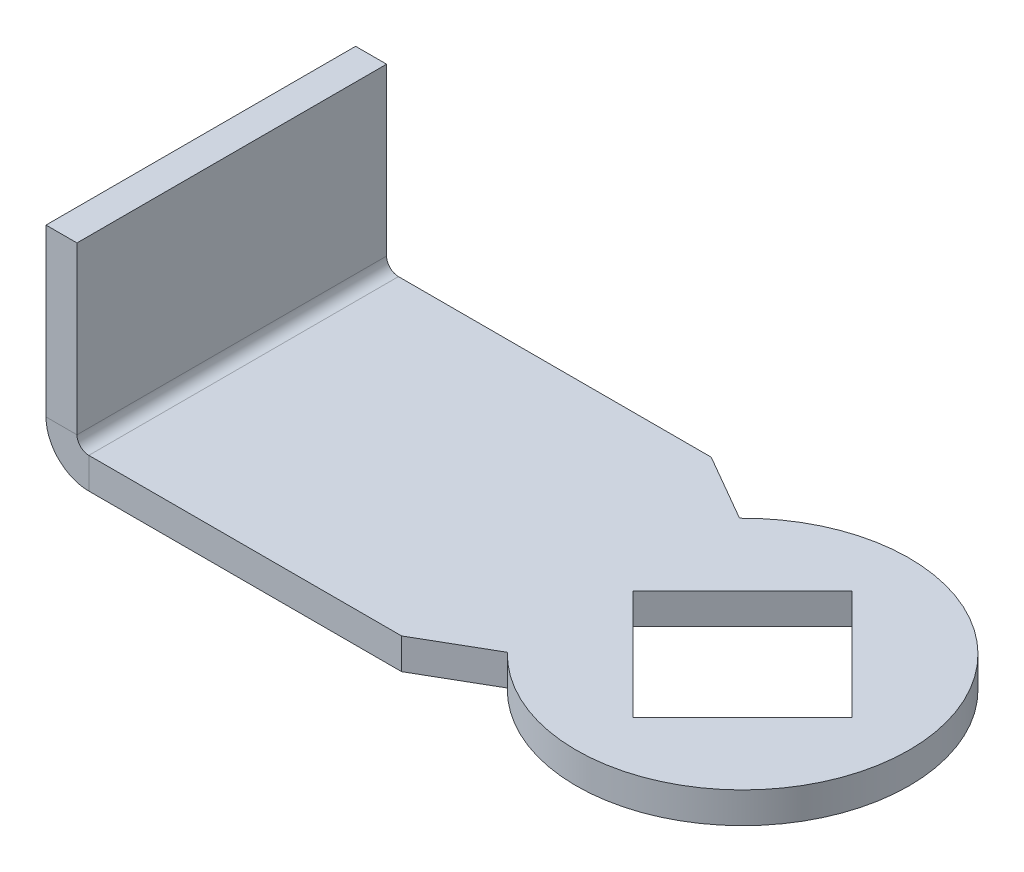
ISO-10303-21;
HEADER;
FILE_DESCRIPTION(('STEP AP214'),'2;1');
FILE_NAME('part.step','',(''),(''),'','','');
FILE_SCHEMA(('AUTOMOTIVE_DESIGN { 1 0 10303 214 1 1 1 1 }'));
ENDSEC;
DATA;
#1=APPLICATION_CONTEXT('core data for automotive mechanical design processes');
#2=APPLICATION_PROTOCOL_DEFINITION('international standard','automotive_design',2000,#1);
#3=PRODUCT_CONTEXT('',#1,'mechanical');
#4=PRODUCT('Part','Part','',(#3));
#5=PRODUCT_RELATED_PRODUCT_CATEGORY('part','',(#4));
#6=PRODUCT_DEFINITION_FORMATION('','',#4);
#7=PRODUCT_DEFINITION_CONTEXT('part definition',#1,'design');
#8=PRODUCT_DEFINITION('design','',#6,#7);
#9=PRODUCT_DEFINITION_SHAPE('','',#8);
#10=(LENGTH_UNIT() NAMED_UNIT(*) SI_UNIT(.MILLI.,.METRE.));
#11=(NAMED_UNIT(*) PLANE_ANGLE_UNIT() SI_UNIT($,.RADIAN.));
#12=(NAMED_UNIT(*) SI_UNIT($,.STERADIAN.) SOLID_ANGLE_UNIT());
#13=UNCERTAINTY_MEASURE_WITH_UNIT(LENGTH_MEASURE(1.E-05),#10,'distance_accuracy_value','');
#14=(GEOMETRIC_REPRESENTATION_CONTEXT(3) GLOBAL_UNCERTAINTY_ASSIGNED_CONTEXT((#13)) GLOBAL_UNIT_ASSIGNED_CONTEXT((#10,
#11,#12)) REPRESENTATION_CONTEXT('',''));
#15=CARTESIAN_POINT('',(0.,0.,0.));
#16=DIRECTION('',(0.,0.,1.));
#17=DIRECTION('',(1.,0.,0.));
#18=AXIS2_PLACEMENT_3D('',#15,#16,#17);
#19=CARTESIAN_POINT('',(-18.,-2.,0.));
#20=DIRECTION('',(0.,1.,0.));
#21=DIRECTION('',(0.,0.,1.));
#22=AXIS2_PLACEMENT_3D('',#19,#20,#21);
#23=PLANE('',#22);
#24=DIRECTION('',(0.,0.,1.));
#25=VECTOR('',#24,1.);
#26=CARTESIAN_POINT('',(-50.2334,-2.,10.));
#27=LINE('',#26,#25);
#28=CARTESIAN_POINT('',(-50.2334,-2.,10.));
#29=VERTEX_POINT('',#28);
#30=CARTESIAN_POINT('',(-50.2334,-2.,-10.));
#31=VERTEX_POINT('',#30);
#32=EDGE_CURVE('E216',#29,#31,#27,.F.);
#33=ORIENTED_EDGE('',*,*,#32,.T.);
#34=DIRECTION('',(-1.,0.,0.));
#35=VECTOR('',#34,1.);
#36=CARTESIAN_POINT('',(-53.,-2.,-10.));
#37=LINE('',#36,#35);
#38=CARTESIAN_POINT('',(-30.0315879192969,-2.,-10.));
#39=VERTEX_POINT('',#38);
#40=EDGE_CURVE('E251',#39,#31,#37,.T.);
#41=ORIENTED_EDGE('',*,*,#40,.F.);
#42=DIRECTION('',(-0.866025403784438,0.,-0.500000000000001));
#43=VECTOR('',#42,1.);
#44=CARTESIAN_POINT('',(-30.0315879192969,-2.,-10.));
#45=LINE('',#44,#43);
#46=CARTESIAN_POINT('',(-25.7014609003747,-2.,-7.5));
#47=VERTEX_POINT('',#46);
#48=EDGE_CURVE('E248',#47,#39,#45,.T.);
#49=ORIENTED_EDGE('',*,*,#48,.F.);
#50=CARTESIAN_POINT('',(-18.,-2.,0.));
#51=DIRECTION('',(0.,1.,0.));
#52=DIRECTION('',(0.,0.,1.));
#53=AXIS2_PLACEMENT_3D('',#50,#51,#52);
#54=CIRCLE('',#53,10.75);
#55=CARTESIAN_POINT('',(-25.7014609003747,-2.,7.49999999999999));
#56=VERTEX_POINT('',#55);
#57=EDGE_CURVE('E245',#56,#47,#54,.T.);
#58=ORIENTED_EDGE('',*,*,#57,.F.);
#59=DIRECTION('',(0.866025403784438,0.,-0.500000000000001));
#60=VECTOR('',#59,1.);
#61=CARTESIAN_POINT('',(-30.0315879192969,-2.,10.));
#62=LINE('',#61,#60);
#63=CARTESIAN_POINT('',(-30.0315879192969,-2.,10.));
#64=VERTEX_POINT('',#63);
#65=EDGE_CURVE('E241',#64,#56,#62,.T.);
#66=ORIENTED_EDGE('',*,*,#65,.F.);
#67=DIRECTION('',(1.,0.,0.));
#68=VECTOR('',#67,1.);
#69=CARTESIAN_POINT('',(-53.,-2.,10.));
#70=LINE('',#69,#68);
#71=EDGE_CURVE('E239',#29,#64,#70,.T.);
#72=ORIENTED_EDGE('',*,*,#71,.F.);
#73=EDGE_LOOP('',(#33,#41,#49,#58,#66,#72));
#74=FACE_BOUND('',#73,.T.);
#75=DIRECTION('',(-0.707106781186548,0.,-0.707106781186548));
#76=VECTOR('',#75,1.);
#77=CARTESIAN_POINT('',(-10.9289321881345,-2.,0.));
#78=LINE('',#77,#76);
#79=CARTESIAN_POINT('',(-10.9289321881345,-2.,0.));
#80=VERTEX_POINT('',#79);
#81=CARTESIAN_POINT('',(-18.,-2.,-7.07106781186548));
#82=VERTEX_POINT('',#81);
#83=EDGE_CURVE('E74',#80,#82,#78,.T.);
#84=ORIENTED_EDGE('',*,*,#83,.T.);
#85=DIRECTION('',(-0.707106781186547,0.,0.707106781186548));
#86=VECTOR('',#85,1.);
#87=CARTESIAN_POINT('',(-18.,-2.,-7.07106781186548));
#88=LINE('',#87,#86);
#89=CARTESIAN_POINT('',(-25.0710678118655,-2.,0.));
#90=VERTEX_POINT('',#89);
#91=EDGE_CURVE('E168',#82,#90,#88,.T.);
#92=ORIENTED_EDGE('',*,*,#91,.T.);
#93=DIRECTION('',(0.707106781186547,0.,0.707106781186548));
#94=VECTOR('',#93,1.);
#95=CARTESIAN_POINT('',(-25.0710678118655,-2.,0.));
#96=LINE('',#95,#94);
#97=CARTESIAN_POINT('',(-18.,-2.,7.07106781186547));
#98=VERTEX_POINT('',#97);
#99=EDGE_CURVE('E174',#90,#98,#96,.T.);
#100=ORIENTED_EDGE('',*,*,#99,.T.);
#101=DIRECTION('',(0.707106781186548,0.,-0.707106781186548));
#102=VECTOR('',#101,1.);
#103=CARTESIAN_POINT('',(-18.,-2.,7.07106781186547));
#104=LINE('',#103,#102);
#105=EDGE_CURVE('E177',#98,#80,#104,.T.);
#106=ORIENTED_EDGE('',*,*,#105,.T.);
#107=EDGE_LOOP('',(#84,#92,#100,#106));
#108=FACE_BOUND('',#107,.T.);
#109=ADVANCED_FACE('F59',(#74,#108),#23,.F.);
#110=CARTESIAN_POINT('',(-18.,0.,0.));
#111=DIRECTION('',(0.,1.,0.));
#112=DIRECTION('',(0.,0.,1.));
#113=AXIS2_PLACEMENT_3D('',#110,#111,#112);
#114=PLANE('',#113);
#115=DIRECTION('',(-1.,0.,0.));
#116=VECTOR('',#115,1.);
#117=CARTESIAN_POINT('',(-53.,0.,-10.));
#118=LINE('',#117,#116);
#119=CARTESIAN_POINT('',(-30.0315879192969,0.,-10.));
#120=VERTEX_POINT('',#119);
#121=CARTESIAN_POINT('',(-50.2334,0.,-10.));
#122=VERTEX_POINT('',#121);
#123=EDGE_CURVE('E242',#120,#122,#118,.T.);
#124=ORIENTED_EDGE('',*,*,#123,.T.);
#125=DIRECTION('',(0.,0.,1.));
#126=VECTOR('',#125,1.);
#127=CARTESIAN_POINT('',(-50.2334,0.,10.));
#128=LINE('',#127,#126);
#129=CARTESIAN_POINT('',(-50.2334,0.,10.));
#130=VERTEX_POINT('',#129);
#131=EDGE_CURVE('E228',#130,#122,#128,.F.);
#132=ORIENTED_EDGE('',*,*,#131,.F.);
#133=DIRECTION('',(1.,0.,0.));
#134=VECTOR('',#133,1.);
#135=CARTESIAN_POINT('',(-53.,0.,10.));
#136=LINE('',#135,#134);
#137=CARTESIAN_POINT('',(-30.0315879192969,0.,10.));
#138=VERTEX_POINT('',#137);
#139=EDGE_CURVE('E236',#130,#138,#136,.T.);
#140=ORIENTED_EDGE('',*,*,#139,.T.);
#141=DIRECTION('',(0.866025403784438,0.,-0.500000000000001));
#142=VECTOR('',#141,1.);
#143=CARTESIAN_POINT('',(-30.0315879192969,0.,10.));
#144=LINE('',#143,#142);
#145=CARTESIAN_POINT('',(-25.7014609003747,0.,7.49999999999999));
#146=VERTEX_POINT('',#145);
#147=EDGE_CURVE('E256',#138,#146,#144,.T.);
#148=ORIENTED_EDGE('',*,*,#147,.T.);
#149=CARTESIAN_POINT('',(-18.,0.,0.));
#150=DIRECTION('',(0.,1.,0.));
#151=DIRECTION('',(0.,0.,1.));
#152=AXIS2_PLACEMENT_3D('',#149,#150,#151);
#153=CIRCLE('',#152,10.75);
#154=CARTESIAN_POINT('',(-25.7014609003747,0.,-7.5));
#155=VERTEX_POINT('',#154);
#156=EDGE_CURVE('E259',#146,#155,#153,.T.);
#157=ORIENTED_EDGE('',*,*,#156,.T.);
#158=DIRECTION('',(-0.866025403784438,0.,-0.500000000000001));
#159=VECTOR('',#158,1.);
#160=CARTESIAN_POINT('',(-30.0315879192969,0.,-10.));
#161=LINE('',#160,#159);
#162=EDGE_CURVE('E262',#155,#120,#161,.T.);
#163=ORIENTED_EDGE('',*,*,#162,.T.);
#164=EDGE_LOOP('',(#124,#132,#140,#148,#157,#163));
#165=FACE_BOUND('',#164,.T.);
#166=DIRECTION('',(0.707106781186547,0.,-0.707106781186548));
#167=VECTOR('',#166,1.);
#168=CARTESIAN_POINT('',(-21.5355339059327,0.,-3.53553390593274));
#169=LINE('',#168,#167);
#170=CARTESIAN_POINT('',(-25.0710678118655,0.,0.));
#171=VERTEX_POINT('',#170);
#172=CARTESIAN_POINT('',(-18.,0.,-7.07106781186548));
#173=VERTEX_POINT('',#172);
#174=EDGE_CURVE('E67',#171,#173,#169,.T.);
#175=ORIENTED_EDGE('',*,*,#174,.T.);
#176=DIRECTION('',(0.707106781186548,0.,0.707106781186548));
#177=VECTOR('',#176,1.);
#178=CARTESIAN_POINT('',(-14.4644660940673,0.,-3.53553390593274));
#179=LINE('',#178,#177);
#180=CARTESIAN_POINT('',(-10.9289321881345,0.,0.));
#181=VERTEX_POINT('',#180);
#182=EDGE_CURVE('E13',#173,#181,#179,.T.);
#183=ORIENTED_EDGE('',*,*,#182,.T.);
#184=DIRECTION('',(-0.707106781186548,0.,0.707106781186548));
#185=VECTOR('',#184,1.);
#186=CARTESIAN_POINT('',(-14.4644660940673,0.,3.53553390593274));
#187=LINE('',#186,#185);
#188=CARTESIAN_POINT('',(-18.,0.,7.07106781186547));
#189=VERTEX_POINT('',#188);
#190=EDGE_CURVE('E269',#181,#189,#187,.T.);
#191=ORIENTED_EDGE('',*,*,#190,.T.);
#192=DIRECTION('',(-0.707106781186547,0.,-0.707106781186548));
#193=VECTOR('',#192,1.);
#194=CARTESIAN_POINT('',(-21.5355339059327,0.,3.53553390593274));
#195=LINE('',#194,#193);
#196=EDGE_CURVE('E278',#189,#171,#195,.T.);
#197=ORIENTED_EDGE('',*,*,#196,.T.);
#198=EDGE_LOOP('',(#175,#183,#191,#197));
#199=FACE_BOUND('',#198,.T.);
#200=ADVANCED_FACE('F281',(#165,#199),#114,.T.);
#201=CARTESIAN_POINT('',(-53.,-2.,10.));
#202=DIRECTION('',(0.,0.,1.));
#203=DIRECTION('',(1.,0.,0.));
#204=AXIS2_PLACEMENT_3D('',#201,#202,#203);
#205=PLANE('',#204);
#206=ORIENTED_EDGE('',*,*,#139,.F.);
#207=DIRECTION('',(0.,-1.,0.));
#208=VECTOR('',#207,1.);
#209=CARTESIAN_POINT('',(-50.2334,0.,10.));
#210=LINE('',#209,#208);
#211=EDGE_CURVE('E222',#130,#29,#210,.T.);
#212=ORIENTED_EDGE('',*,*,#211,.T.);
#213=ORIENTED_EDGE('',*,*,#71,.T.);
#214=DIRECTION('',(0.,1.,0.));
#215=VECTOR('',#214,1.);
#216=CARTESIAN_POINT('',(-30.0315879192969,-2.,10.));
#217=LINE('',#216,#215);
#218=EDGE_CURVE('E254',#64,#138,#217,.T.);
#219=ORIENTED_EDGE('',*,*,#218,.T.);
#220=EDGE_LOOP('',(#206,#212,#213,#219));
#221=FACE_BOUND('',#220,.T.);
#222=ADVANCED_FACE('F61',(#221),#205,.T.);
#223=CARTESIAN_POINT('',(-53.,-2.,-10.));
#224=DIRECTION('',(0.,0.,-1.));
#225=DIRECTION('',(-1.,0.,0.));
#226=AXIS2_PLACEMENT_3D('',#223,#224,#225);
#227=PLANE('',#226);
#228=DIRECTION('',(0.,-1.,0.));
#229=VECTOR('',#228,1.);
#230=CARTESIAN_POINT('',(-50.2334,0.,-10.));
#231=LINE('',#230,#229);
#232=EDGE_CURVE('E233',#122,#31,#231,.T.);
#233=ORIENTED_EDGE('',*,*,#232,.F.);
#234=ORIENTED_EDGE('',*,*,#123,.F.);
#235=DIRECTION('',(0.,1.,0.));
#236=VECTOR('',#235,1.);
#237=CARTESIAN_POINT('',(-30.0315879192969,-2.,-10.));
#238=LINE('',#237,#236);
#239=EDGE_CURVE('E267',#39,#120,#238,.T.);
#240=ORIENTED_EDGE('',*,*,#239,.F.);
#241=ORIENTED_EDGE('',*,*,#40,.T.);
#242=EDGE_LOOP('',(#233,#234,#240,#241));
#243=FACE_BOUND('',#242,.T.);
#244=ADVANCED_FACE('F303',(#243),#227,.T.);
#245=CARTESIAN_POINT('',(-30.0315879192969,-2.,-10.));
#246=DIRECTION('',(0.500000000000001,0.,-0.866025403784438));
#247=DIRECTION('',(-0.866025403784438,0.,-0.500000000000001));
#248=AXIS2_PLACEMENT_3D('',#245,#246,#247);
#249=PLANE('',#248);
#250=ORIENTED_EDGE('',*,*,#162,.F.);
#251=DIRECTION('',(0.,1.,0.));
#252=VECTOR('',#251,1.);
#253=CARTESIAN_POINT('',(-25.7014609003747,-2.,-7.5));
#254=LINE('',#253,#252);
#255=EDGE_CURVE('E270',#47,#155,#254,.T.);
#256=ORIENTED_EDGE('',*,*,#255,.F.);
#257=ORIENTED_EDGE('',*,*,#48,.T.);
#258=ORIENTED_EDGE('',*,*,#239,.T.);
#259=EDGE_LOOP('',(#250,#256,#257,#258));
#260=FACE_BOUND('',#259,.T.);
#261=ADVANCED_FACE('F306',(#260),#249,.T.);
#262=CARTESIAN_POINT('',(-18.,-2.,0.));
#263=DIRECTION('',(0.,1.,0.));
#264=DIRECTION('',(0.,0.,1.));
#265=AXIS2_PLACEMENT_3D('',#262,#263,#264);
#266=CYLINDRICAL_SURFACE('',#265,10.75);
#267=ORIENTED_EDGE('',*,*,#156,.F.);
#268=DIRECTION('',(0.,1.,0.));
#269=VECTOR('',#268,1.);
#270=CARTESIAN_POINT('',(-25.7014609003747,-2.,7.49999999999999));
#271=LINE('',#270,#269);
#272=EDGE_CURVE('E272',#56,#146,#271,.T.);
#273=ORIENTED_EDGE('',*,*,#272,.F.);
#274=ORIENTED_EDGE('',*,*,#57,.T.);
#275=ORIENTED_EDGE('',*,*,#255,.T.);
#276=EDGE_LOOP('',(#267,#273,#274,#275));
#277=FACE_BOUND('',#276,.T.);
#278=ADVANCED_FACE('F310',(#277),#266,.T.);
#279=CARTESIAN_POINT('',(-30.0315879192969,-2.,10.));
#280=DIRECTION('',(0.500000000000001,0.,0.866025403784438));
#281=DIRECTION('',(0.866025403784438,0.,-0.500000000000001));
#282=AXIS2_PLACEMENT_3D('',#279,#280,#281);
#283=PLANE('',#282);
#284=ORIENTED_EDGE('',*,*,#147,.F.);
#285=ORIENTED_EDGE('',*,*,#218,.F.);
#286=ORIENTED_EDGE('',*,*,#65,.T.);
#287=ORIENTED_EDGE('',*,*,#272,.T.);
#288=EDGE_LOOP('',(#284,#285,#286,#287));
#289=FACE_BOUND('',#288,.T.);
#290=ADVANCED_FACE('F313',(#289),#283,.T.);
#291=CARTESIAN_POINT('',(-50.2334,0.766600000000002,-10.));
#292=DIRECTION('',(0.,0.,-1.));
#293=DIRECTION('',(-1.,0.,0.));
#294=AXIS2_PLACEMENT_3D('',#291,#292,#293);
#295=PLANE('',#294);
#296=DIRECTION('',(1.,0.,0.));
#297=VECTOR('',#296,1.);
#298=CARTESIAN_POINT('',(-53.,0.766599999999992,-10.));
#299=LINE('',#298,#297);
#300=CARTESIAN_POINT('',(-51.,0.766599999999999,-10.));
#301=VERTEX_POINT('',#300);
#302=CARTESIAN_POINT('',(-53.,0.766599999999992,-10.));
#303=VERTEX_POINT('',#302);
#304=EDGE_CURVE('E164',#301,#303,#299,.F.);
#305=ORIENTED_EDGE('',*,*,#304,.F.);
#306=CARTESIAN_POINT('',(-50.2334,0.766600000000002,-10.));
#307=DIRECTION('',(0.,0.,1.));
#308=DIRECTION('',(1.,0.,0.));
#309=AXIS2_PLACEMENT_3D('',#306,#307,#308);
#310=CIRCLE('',#309,0.766599999999999);
#311=EDGE_CURVE('E225',#122,#301,#310,.F.);
#312=ORIENTED_EDGE('',*,*,#311,.F.);
#313=ORIENTED_EDGE('',*,*,#232,.T.);
#314=CARTESIAN_POINT('',(-50.2334,0.766600000000002,-10.));
#315=DIRECTION('',(0.,0.,1.));
#316=DIRECTION('',(1.,0.,0.));
#317=AXIS2_PLACEMENT_3D('',#314,#315,#316);
#318=CIRCLE('',#317,2.7666);
#319=EDGE_CURVE('E218',#31,#303,#318,.F.);
#320=ORIENTED_EDGE('',*,*,#319,.T.);
#321=EDGE_LOOP('',(#305,#312,#313,#320));
#322=FACE_BOUND('',#321,.T.);
#323=ADVANCED_FACE('F316',(#322),#295,.T.);
#324=CARTESIAN_POINT('',(-50.2334,0.766600000000002,10.));
#325=DIRECTION('',(0.,0.,-1.));
#326=DIRECTION('',(-1.,0.,0.));
#327=AXIS2_PLACEMENT_3D('',#324,#325,#326);
#328=PLANE('',#327);
#329=CARTESIAN_POINT('',(-50.2334,0.766600000000002,10.));
#330=DIRECTION('',(0.,0.,1.));
#331=DIRECTION('',(1.,0.,0.));
#332=AXIS2_PLACEMENT_3D('',#329,#330,#331);
#333=CIRCLE('',#332,0.766599999999999);
#334=CARTESIAN_POINT('',(-51.,0.766599999999999,10.));
#335=VERTEX_POINT('',#334);
#336=EDGE_CURVE('E189',#335,#130,#333,.T.);
#337=ORIENTED_EDGE('',*,*,#336,.F.);
#338=DIRECTION('',(1.,0.,0.));
#339=VECTOR('',#338,1.);
#340=CARTESIAN_POINT('',(-51.,0.766599999999999,10.));
#341=LINE('',#340,#339);
#342=CARTESIAN_POINT('',(-53.,0.766599999999992,10.));
#343=VERTEX_POINT('',#342);
#344=EDGE_CURVE('E209',#335,#343,#341,.F.);
#345=ORIENTED_EDGE('',*,*,#344,.T.);
#346=CARTESIAN_POINT('',(-50.2334,0.766600000000002,10.));
#347=DIRECTION('',(0.,0.,1.));
#348=DIRECTION('',(1.,0.,0.));
#349=AXIS2_PLACEMENT_3D('',#346,#347,#348);
#350=CIRCLE('',#349,2.7666);
#351=EDGE_CURVE('E219',#343,#29,#350,.T.);
#352=ORIENTED_EDGE('',*,*,#351,.T.);
#353=ORIENTED_EDGE('',*,*,#211,.F.);
#354=EDGE_LOOP('',(#337,#345,#352,#353));
#355=FACE_BOUND('',#354,.T.);
#356=ADVANCED_FACE('F300',(#355),#328,.F.);
#357=CARTESIAN_POINT('',(-50.2334,0.766600000000002,10.));
#358=DIRECTION('',(0.,0.,1.));
#359=DIRECTION('',(-1.,0.,0.));
#360=AXIS2_PLACEMENT_3D('',#357,#358,#359);
#361=CYLINDRICAL_SURFACE('',#360,2.7666);
#362=ORIENTED_EDGE('',*,*,#32,.F.);
#363=ORIENTED_EDGE('',*,*,#351,.F.);
#364=DIRECTION('',(0.,0.,1.));
#365=VECTOR('',#364,1.);
#366=CARTESIAN_POINT('',(-53.,0.766599999999992,-10.));
#367=LINE('',#366,#365);
#368=EDGE_CURVE('E207',#343,#303,#367,.F.);
#369=ORIENTED_EDGE('',*,*,#368,.T.);
#370=ORIENTED_EDGE('',*,*,#319,.F.);
#371=EDGE_LOOP('',(#362,#363,#369,#370));
#372=FACE_BOUND('',#371,.T.);
#373=ADVANCED_FACE('F338',(#372),#361,.T.);
#374=CARTESIAN_POINT('',(-50.2334,0.766600000000002,10.));
#375=DIRECTION('',(0.,0.,1.));
#376=DIRECTION('',(-1.,0.,0.));
#377=AXIS2_PLACEMENT_3D('',#374,#375,#376);
#378=CYLINDRICAL_SURFACE('',#377,0.766599999999999);
#379=ORIENTED_EDGE('',*,*,#131,.T.);
#380=ORIENTED_EDGE('',*,*,#311,.T.);
#381=DIRECTION('',(0.,0.,1.));
#382=VECTOR('',#381,1.);
#383=CARTESIAN_POINT('',(-51.,0.766599999999999,-10.));
#384=LINE('',#383,#382);
#385=EDGE_CURVE('E212',#301,#335,#384,.T.);
#386=ORIENTED_EDGE('',*,*,#385,.T.);
#387=ORIENTED_EDGE('',*,*,#336,.T.);
#388=EDGE_LOOP('',(#379,#380,#386,#387));
#389=FACE_BOUND('',#388,.T.);
#390=ADVANCED_FACE('F359',(#389),#378,.F.);
#391=CARTESIAN_POINT('',(-53.,0.,-10.));
#392=DIRECTION('',(0.,0.,1.));
#393=DIRECTION('',(1.,0.,0.));
#394=AXIS2_PLACEMENT_3D('',#391,#392,#393);
#395=PLANE('',#394);
#396=ORIENTED_EDGE('',*,*,#304,.T.);
#397=DIRECTION('',(0.,-1.,0.));
#398=VECTOR('',#397,1.);
#399=CARTESIAN_POINT('',(-53.,-1.98858463672686E-13,-10.));
#400=LINE('',#399,#398);
#401=CARTESIAN_POINT('',(-53.,11.5,-10.));
#402=VERTEX_POINT('',#401);
#403=EDGE_CURVE('E197',#402,#303,#400,.T.);
#404=ORIENTED_EDGE('',*,*,#403,.F.);
#405=DIRECTION('',(1.,0.,0.));
#406=VECTOR('',#405,1.);
#407=CARTESIAN_POINT('',(-53.,11.5,-10.));
#408=LINE('',#407,#406);
#409=CARTESIAN_POINT('',(-51.,11.5,-10.));
#410=VERTEX_POINT('',#409);
#411=EDGE_CURVE('E190',#402,#410,#408,.T.);
#412=ORIENTED_EDGE('',*,*,#411,.T.);
#413=DIRECTION('',(0.,1.,0.));
#414=VECTOR('',#413,1.);
#415=CARTESIAN_POINT('',(-51.,0.,-10.));
#416=LINE('',#415,#414);
#417=EDGE_CURVE('E204',#410,#301,#416,.F.);
#418=ORIENTED_EDGE('',*,*,#417,.T.);
#419=EDGE_LOOP('',(#396,#404,#412,#418));
#420=FACE_BOUND('',#419,.T.);
#421=ADVANCED_FACE('F356',(#420),#395,.F.);
#422=CARTESIAN_POINT('',(-53.,11.5,10.));
#423=DIRECTION('',(0.,0.,-1.));
#424=DIRECTION('',(-1.,0.,0.));
#425=AXIS2_PLACEMENT_3D('',#422,#423,#424);
#426=PLANE('',#425);
#427=ORIENTED_EDGE('',*,*,#344,.F.);
#428=DIRECTION('',(0.,-1.,0.));
#429=VECTOR('',#428,1.);
#430=CARTESIAN_POINT('',(-51.,11.5,10.));
#431=LINE('',#430,#429);
#432=CARTESIAN_POINT('',(-51.,11.5,10.));
#433=VERTEX_POINT('',#432);
#434=EDGE_CURVE('E202',#335,#433,#431,.F.);
#435=ORIENTED_EDGE('',*,*,#434,.T.);
#436=DIRECTION('',(1.,0.,0.));
#437=VECTOR('',#436,1.);
#438=CARTESIAN_POINT('',(-53.,11.5,10.));
#439=LINE('',#438,#437);
#440=CARTESIAN_POINT('',(-53.,11.5,10.));
#441=VERTEX_POINT('',#440);
#442=EDGE_CURVE('E186',#441,#433,#439,.T.);
#443=ORIENTED_EDGE('',*,*,#442,.F.);
#444=DIRECTION('',(0.,1.,0.));
#445=VECTOR('',#444,1.);
#446=CARTESIAN_POINT('',(-53.,-1.98858463672686E-13,10.));
#447=LINE('',#446,#445);
#448=EDGE_CURVE('E195',#343,#441,#447,.T.);
#449=ORIENTED_EDGE('',*,*,#448,.F.);
#450=EDGE_LOOP('',(#427,#435,#443,#449));
#451=FACE_BOUND('',#450,.T.);
#452=ADVANCED_FACE('F347',(#451),#426,.F.);
#453=CARTESIAN_POINT('',(-53.,-1.98858463672686E-13,0.));
#454=DIRECTION('',(1.,0.,0.));
#455=DIRECTION('',(0.,1.,0.));
#456=AXIS2_PLACEMENT_3D('',#453,#454,#455);
#457=PLANE('',#456);
#458=ORIENTED_EDGE('',*,*,#368,.F.);
#459=ORIENTED_EDGE('',*,*,#448,.T.);
#460=DIRECTION('',(0.,0.,-1.));
#461=VECTOR('',#460,1.);
#462=CARTESIAN_POINT('',(-53.,11.5,0.));
#463=LINE('',#462,#461);
#464=EDGE_CURVE('E193',#441,#402,#463,.T.);
#465=ORIENTED_EDGE('',*,*,#464,.T.);
#466=ORIENTED_EDGE('',*,*,#403,.T.);
#467=EDGE_LOOP('',(#458,#459,#465,#466));
#468=FACE_BOUND('',#467,.T.);
#469=ADVANCED_FACE('F342',(#468),#457,.F.);
#470=CARTESIAN_POINT('',(-51.,-1.91875500995E-13,0.));
#471=DIRECTION('',(1.,0.,0.));
#472=DIRECTION('',(0.,1.,0.));
#473=AXIS2_PLACEMENT_3D('',#470,#471,#472);
#474=PLANE('',#473);
#475=ORIENTED_EDGE('',*,*,#434,.F.);
#476=ORIENTED_EDGE('',*,*,#385,.F.);
#477=ORIENTED_EDGE('',*,*,#417,.F.);
#478=DIRECTION('',(0.,0.,1.));
#479=VECTOR('',#478,1.);
#480=CARTESIAN_POINT('',(-51.,11.5,-10.));
#481=LINE('',#480,#479);
#482=EDGE_CURVE('E200',#433,#410,#481,.F.);
#483=ORIENTED_EDGE('',*,*,#482,.F.);
#484=EDGE_LOOP('',(#475,#476,#477,#483));
#485=FACE_BOUND('',#484,.T.);
#486=ADVANCED_FACE('F362',(#485),#474,.T.);
#487=CARTESIAN_POINT('',(-53.,11.5,-10.));
#488=DIRECTION('',(0.,-1.,0.));
#489=DIRECTION('',(1.,0.,0.));
#490=AXIS2_PLACEMENT_3D('',#487,#488,#489);
#491=PLANE('',#490);
#492=ORIENTED_EDGE('',*,*,#482,.T.);
#493=ORIENTED_EDGE('',*,*,#411,.F.);
#494=ORIENTED_EDGE('',*,*,#464,.F.);
#495=ORIENTED_EDGE('',*,*,#442,.T.);
#496=EDGE_LOOP('',(#492,#493,#494,#495));
#497=FACE_BOUND('',#496,.T.);
#498=ADVANCED_FACE('F353',(#497),#491,.F.);
#499=CARTESIAN_POINT('',(-10.9289321881345,11.5,0.));
#500=DIRECTION('',(-0.707106781186548,0.,0.707106781186548));
#501=DIRECTION('',(0.707106781186548,0.,0.707106781186548));
#502=AXIS2_PLACEMENT_3D('',#499,#500,#501);
#503=PLANE('',#502);
#504=DIRECTION('',(0.,-1.,0.));
#505=VECTOR('',#504,1.);
#506=CARTESIAN_POINT('',(-18.,11.5,-7.07106781186548));
#507=LINE('',#506,#505);
#508=EDGE_CURVE('E159',#173,#82,#507,.T.);
#509=ORIENTED_EDGE('',*,*,#508,.T.);
#510=ORIENTED_EDGE('',*,*,#83,.F.);
#511=DIRECTION('',(0.,-1.,0.));
#512=VECTOR('',#511,1.);
#513=CARTESIAN_POINT('',(-10.9289321881345,11.5,0.));
#514=LINE('',#513,#512);
#515=EDGE_CURVE('E182',#181,#80,#514,.T.);
#516=ORIENTED_EDGE('',*,*,#515,.F.);
#517=ORIENTED_EDGE('',*,*,#182,.F.);
#518=EDGE_LOOP('',(#509,#510,#516,#517));
#519=FACE_BOUND('',#518,.T.);
#520=ADVANCED_FACE('F161',(#519),#503,.T.);
#521=CARTESIAN_POINT('',(-18.,11.5,-7.07106781186548));
#522=DIRECTION('',(0.707106781186548,0.,0.707106781186547));
#523=DIRECTION('',(0.707106781186547,0.,-0.707106781186548));
#524=AXIS2_PLACEMENT_3D('',#521,#522,#523);
#525=PLANE('',#524);
#526=DIRECTION('',(0.,-1.,0.));
#527=VECTOR('',#526,1.);
#528=CARTESIAN_POINT('',(-25.0710678118655,11.5,0.));
#529=LINE('',#528,#527);
#530=EDGE_CURVE('E165',#171,#90,#529,.T.);
#531=ORIENTED_EDGE('',*,*,#530,.T.);
#532=ORIENTED_EDGE('',*,*,#91,.F.);
#533=ORIENTED_EDGE('',*,*,#508,.F.);
#534=ORIENTED_EDGE('',*,*,#174,.F.);
#535=EDGE_LOOP('',(#531,#532,#533,#534));
#536=FACE_BOUND('',#535,.T.);
#537=ADVANCED_FACE('F169',(#536),#525,.T.);
#538=CARTESIAN_POINT('',(-25.0710678118655,11.5,0.));
#539=DIRECTION('',(0.707106781186548,0.,-0.707106781186547));
#540=DIRECTION('',(-0.707106781186547,0.,-0.707106781186548));
#541=AXIS2_PLACEMENT_3D('',#538,#539,#540);
#542=PLANE('',#541);
#543=DIRECTION('',(0.,-1.,0.));
#544=VECTOR('',#543,1.);
#545=CARTESIAN_POINT('',(-18.,11.5,7.07106781186547));
#546=LINE('',#545,#544);
#547=EDGE_CURVE('E82',#189,#98,#546,.T.);
#548=ORIENTED_EDGE('',*,*,#547,.T.);
#549=ORIENTED_EDGE('',*,*,#99,.F.);
#550=ORIENTED_EDGE('',*,*,#530,.F.);
#551=ORIENTED_EDGE('',*,*,#196,.F.);
#552=EDGE_LOOP('',(#548,#549,#550,#551));
#553=FACE_BOUND('',#552,.T.);
#554=ADVANCED_FACE('F283',(#553),#542,.T.);
#555=CARTESIAN_POINT('',(-18.,11.5,7.07106781186547));
#556=DIRECTION('',(-0.707106781186548,0.,-0.707106781186548));
#557=DIRECTION('',(-0.707106781186548,0.,0.707106781186548));
#558=AXIS2_PLACEMENT_3D('',#555,#556,#557);
#559=PLANE('',#558);
#560=ORIENTED_EDGE('',*,*,#515,.T.);
#561=ORIENTED_EDGE('',*,*,#105,.F.);
#562=ORIENTED_EDGE('',*,*,#547,.F.);
#563=ORIENTED_EDGE('',*,*,#190,.F.);
#564=EDGE_LOOP('',(#560,#561,#562,#563));
#565=FACE_BOUND('',#564,.T.);
#566=ADVANCED_FACE('F284',(#565),#559,.T.);
#567=CLOSED_SHELL('',(#109,#200,#222,#244,#261,#278,#290,#323,#356,#373,#390,#421,#452,#469,
#486,#498,#520,#537,#554,#566));
#568=MANIFOLD_SOLID_BREP('B2',#567);
#569=ADVANCED_BREP_SHAPE_REPRESENTATION('',(#18,#568),#14);
#570=SHAPE_DEFINITION_REPRESENTATION(#9,#569);
ENDSEC;
END-ISO-10303-21;
